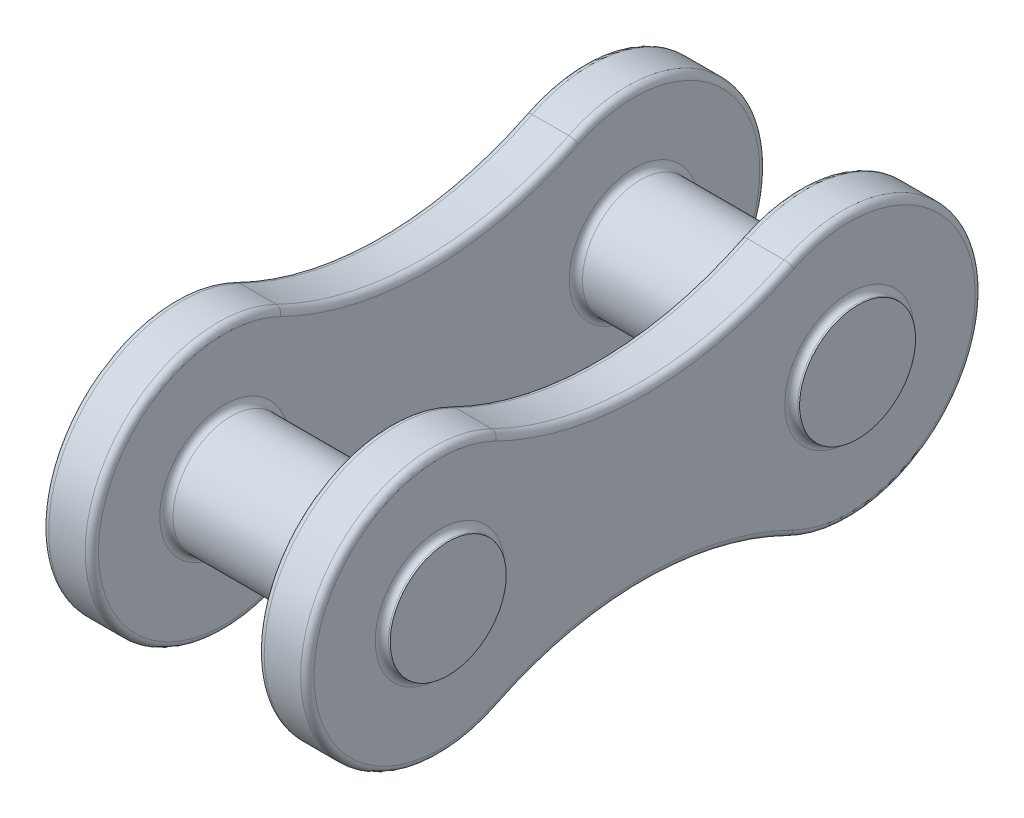
ISO-10303-21;
HEADER;
FILE_DESCRIPTION(('STEP AP214'),'2;1');
FILE_NAME('part.step','',(''),(''),'','','');
FILE_SCHEMA(('AUTOMOTIVE_DESIGN { 1 0 10303 214 1 1 1 1 }'));
ENDSEC;
DATA;
#1=APPLICATION_CONTEXT('core data for automotive mechanical design processes');
#2=APPLICATION_PROTOCOL_DEFINITION('international standard','automotive_design',2000,#1);
#3=PRODUCT_CONTEXT('',#1,'mechanical');
#4=PRODUCT('Part','Part','',(#3));
#5=PRODUCT_RELATED_PRODUCT_CATEGORY('part','',(#4));
#6=PRODUCT_DEFINITION_FORMATION('','',#4);
#7=PRODUCT_DEFINITION_CONTEXT('part definition',#1,'design');
#8=PRODUCT_DEFINITION('design','',#6,#7);
#9=PRODUCT_DEFINITION_SHAPE('','',#8);
#10=(LENGTH_UNIT() NAMED_UNIT(*) SI_UNIT(.MILLI.,.METRE.));
#11=(NAMED_UNIT(*) PLANE_ANGLE_UNIT() SI_UNIT($,.RADIAN.));
#12=(NAMED_UNIT(*) SI_UNIT($,.STERADIAN.) SOLID_ANGLE_UNIT());
#13=UNCERTAINTY_MEASURE_WITH_UNIT(LENGTH_MEASURE(1.E-05),#10,'distance_accuracy_value','');
#14=(GEOMETRIC_REPRESENTATION_CONTEXT(3) GLOBAL_UNCERTAINTY_ASSIGNED_CONTEXT((#13)) GLOBAL_UNIT_ASSIGNED_CONTEXT((#10,
#11,#12)) REPRESENTATION_CONTEXT('',''));
#15=CARTESIAN_POINT('',(0.,0.,0.));
#16=DIRECTION('',(0.,0.,1.));
#17=DIRECTION('',(1.,0.,0.));
#18=AXIS2_PLACEMENT_3D('',#15,#16,#17);
#19=CARTESIAN_POINT('',(4.,6.28230401604379,-3.0875));
#20=DIRECTION('',(1.,0.,0.));
#21=DIRECTION('',(0.,0.,-1.));
#22=AXIS2_PLACEMENT_3D('',#19,#20,#21);
#23=PLANE('',#22);
#24=CARTESIAN_POINT('',(4.,0.,-6.175));
#25=DIRECTION('',(1.,0.,0.));
#26=DIRECTION('',(0.,0.,-1.));
#27=AXIS2_PLACEMENT_3D('',#24,#25,#26);
#28=CIRCLE('',#27,1.95);
#29=CARTESIAN_POINT('',(4.,0.,-8.125));
#30=VERTEX_POINT('',#29);
#31=EDGE_CURVE('E52',#30,#30,#28,.F.);
#32=ORIENTED_EDGE('',*,*,#31,.T.);
#33=EDGE_LOOP('',(#32));
#34=FACE_BOUND('',#33,.T.);
#35=CARTESIAN_POINT('',(4.,-12.5646080320876,0.));
#36=DIRECTION('',(1.,0.,0.));
#37=DIRECTION('',(0.,0.,-1.));
#38=AXIS2_PLACEMENT_3D('',#35,#36,#37);
#39=CIRCLE('',#38,10.2);
#40=CARTESIAN_POINT('',(4.,-3.41039360870949,4.49892857142857));
#41=VERTEX_POINT('',#40);
#42=CARTESIAN_POINT('',(4.,-3.41039360870949,-4.49892857142857));
#43=VERTEX_POINT('',#42);
#44=EDGE_CURVE('E60',#41,#43,#39,.F.);
#45=ORIENTED_EDGE('',*,*,#44,.T.);
#46=CARTESIAN_POINT('',(4.,0.,-6.175));
#47=DIRECTION('',(1.,0.,0.));
#48=DIRECTION('',(0.,0.,-1.));
#49=AXIS2_PLACEMENT_3D('',#46,#47,#48);
#50=CIRCLE('',#49,3.8);
#51=CARTESIAN_POINT('',(4.,3.41039360870949,-4.49892857142857));
#52=VERTEX_POINT('',#51);
#53=EDGE_CURVE('E281',#43,#52,#50,.T.);
#54=ORIENTED_EDGE('',*,*,#53,.T.);
#55=CARTESIAN_POINT('',(4.,12.5646080320876,0.));
#56=DIRECTION('',(1.,0.,0.));
#57=DIRECTION('',(0.,0.,-1.));
#58=AXIS2_PLACEMENT_3D('',#55,#56,#57);
#59=CIRCLE('',#58,10.2);
#60=CARTESIAN_POINT('',(4.,3.41039360870949,4.49892857142857));
#61=VERTEX_POINT('',#60);
#62=EDGE_CURVE('E277',#52,#61,#59,.F.);
#63=ORIENTED_EDGE('',*,*,#62,.T.);
#64=CARTESIAN_POINT('',(4.,0.,6.175));
#65=DIRECTION('',(1.,0.,0.));
#66=DIRECTION('',(0.,0.,-1.));
#67=AXIS2_PLACEMENT_3D('',#64,#65,#66);
#68=CIRCLE('',#67,3.8);
#69=EDGE_CURVE('E65',#61,#41,#68,.T.);
#70=ORIENTED_EDGE('',*,*,#69,.T.);
#71=EDGE_LOOP('',(#45,#54,#63,#70));
#72=FACE_BOUND('',#71,.T.);
#73=CARTESIAN_POINT('',(4.,0.,6.175));
#74=DIRECTION('',(1.,0.,0.));
#75=DIRECTION('',(0.,0.,-1.));
#76=AXIS2_PLACEMENT_3D('',#73,#74,#75);
#77=CIRCLE('',#76,1.95);
#78=CARTESIAN_POINT('',(4.,0.,4.225));
#79=VERTEX_POINT('',#78);
#80=EDGE_CURVE('E274',#79,#79,#77,.F.);
#81=ORIENTED_EDGE('',*,*,#80,.T.);
#82=EDGE_LOOP('',(#81));
#83=FACE_BOUND('',#82,.T.);
#84=ADVANCED_FACE('F43',(#34,#72,#83),#23,.T.);
#85=CARTESIAN_POINT('',(2.5,6.28230401604379,-3.0875));
#86=DIRECTION('',(1.,0.,0.));
#87=DIRECTION('',(0.,0.,-1.));
#88=AXIS2_PLACEMENT_3D('',#85,#86,#87);
#89=PLANE('',#88);
#90=CARTESIAN_POINT('',(2.5,0.,-6.175));
#91=DIRECTION('',(1.,0.,0.));
#92=DIRECTION('',(0.,0.,-1.));
#93=AXIS2_PLACEMENT_3D('',#90,#91,#92);
#94=CIRCLE('',#93,1.95);
#95=CARTESIAN_POINT('',(2.5,0.,-8.125));
#96=VERTEX_POINT('',#95);
#97=EDGE_CURVE('E188',#96,#96,#94,.T.);
#98=ORIENTED_EDGE('',*,*,#97,.T.);
#99=EDGE_LOOP('',(#98));
#100=FACE_BOUND('',#99,.T.);
#101=CARTESIAN_POINT('',(2.5,0.,6.175));
#102=DIRECTION('',(1.,0.,0.));
#103=DIRECTION('',(0.,0.,-1.));
#104=AXIS2_PLACEMENT_3D('',#101,#102,#103);
#105=CIRCLE('',#104,1.95);
#106=CARTESIAN_POINT('',(2.5,0.,4.225));
#107=VERTEX_POINT('',#106);
#108=EDGE_CURVE('E185',#107,#107,#105,.T.);
#109=ORIENTED_EDGE('',*,*,#108,.T.);
#110=EDGE_LOOP('',(#109));
#111=FACE_BOUND('',#110,.T.);
#112=CARTESIAN_POINT('',(2.5,-12.5646080320876,0.));
#113=DIRECTION('',(1.,0.,0.));
#114=DIRECTION('',(0.,0.,-1.));
#115=AXIS2_PLACEMENT_3D('',#112,#113,#114);
#116=CIRCLE('',#115,10.2);
#117=CARTESIAN_POINT('',(2.5,-3.41039360870949,-4.49892857142857));
#118=VERTEX_POINT('',#117);
#119=CARTESIAN_POINT('',(2.5,-3.41039360870949,4.49892857142857));
#120=VERTEX_POINT('',#119);
#121=EDGE_CURVE('E184',#118,#120,#116,.T.);
#122=ORIENTED_EDGE('',*,*,#121,.T.);
#123=CARTESIAN_POINT('',(2.5,0.,6.175));
#124=DIRECTION('',(1.,0.,0.));
#125=DIRECTION('',(0.,0.,-1.));
#126=AXIS2_PLACEMENT_3D('',#123,#124,#125);
#127=CIRCLE('',#126,3.8);
#128=CARTESIAN_POINT('',(2.5,3.41039360870949,4.49892857142857));
#129=VERTEX_POINT('',#128);
#130=EDGE_CURVE('E163',#120,#129,#127,.F.);
#131=ORIENTED_EDGE('',*,*,#130,.T.);
#132=CARTESIAN_POINT('',(2.5,12.5646080320876,0.));
#133=DIRECTION('',(1.,0.,0.));
#134=DIRECTION('',(0.,0.,-1.));
#135=AXIS2_PLACEMENT_3D('',#132,#133,#134);
#136=CIRCLE('',#135,10.2);
#137=CARTESIAN_POINT('',(2.5,3.41039360870949,-4.49892857142857));
#138=VERTEX_POINT('',#137);
#139=EDGE_CURVE('E173',#129,#138,#136,.T.);
#140=ORIENTED_EDGE('',*,*,#139,.T.);
#141=CARTESIAN_POINT('',(2.5,0.,-6.175));
#142=DIRECTION('',(1.,0.,0.));
#143=DIRECTION('',(0.,0.,-1.));
#144=AXIS2_PLACEMENT_3D('',#141,#142,#143);
#145=CIRCLE('',#144,3.8);
#146=EDGE_CURVE('E179',#138,#118,#145,.F.);
#147=ORIENTED_EDGE('',*,*,#146,.T.);
#148=EDGE_LOOP('',(#122,#131,#140,#147));
#149=FACE_BOUND('',#148,.T.);
#150=ADVANCED_FACE('F182',(#100,#111,#149),#89,.F.);
#151=CARTESIAN_POINT('',(4.,12.5646080320876,0.));
#152=DIRECTION('',(-1.,0.,0.));
#153=DIRECTION('',(0.,0.,1.));
#154=AXIS2_PLACEMENT_3D('',#151,#152,#153);
#155=CYLINDRICAL_SURFACE('',#154,10.);
#156=DIRECTION('',(-1.,0.,0.));
#157=VECTOR('',#156,1.);
#158=CARTESIAN_POINT('',(4.,3.58988800916788,-4.41071428571429));
#159=LINE('',#158,#157);
#160=CARTESIAN_POINT('',(3.8,3.58988800916788,-4.41071428571429));
#161=VERTEX_POINT('',#160);
#162=CARTESIAN_POINT('',(2.7,3.58988800916788,-4.41071428571429));
#163=VERTEX_POINT('',#162);
#164=EDGE_CURVE('E359',#161,#163,#159,.T.);
#165=ORIENTED_EDGE('',*,*,#164,.T.);
#166=CARTESIAN_POINT('',(2.7,12.5646080320876,0.));
#167=DIRECTION('',(1.,0.,0.));
#168=DIRECTION('',(0.,0.,-1.));
#169=AXIS2_PLACEMENT_3D('',#166,#167,#168);
#170=CIRCLE('',#169,10.);
#171=CARTESIAN_POINT('',(2.7,3.58988800916788,4.41071428571429));
#172=VERTEX_POINT('',#171);
#173=EDGE_CURVE('E215',#163,#172,#170,.F.);
#174=ORIENTED_EDGE('',*,*,#173,.T.);
#175=DIRECTION('',(-1.,0.,0.));
#176=VECTOR('',#175,1.);
#177=CARTESIAN_POINT('',(4.,3.58988800916788,4.41071428571429));
#178=LINE('',#177,#176);
#179=CARTESIAN_POINT('',(3.8,3.58988800916788,4.41071428571429));
#180=VERTEX_POINT('',#179);
#181=EDGE_CURVE('E331',#180,#172,#178,.T.);
#182=ORIENTED_EDGE('',*,*,#181,.F.);
#183=CARTESIAN_POINT('',(3.8,12.5646080320876,0.));
#184=DIRECTION('',(1.,0.,0.));
#185=DIRECTION('',(0.,0.,-1.));
#186=AXIS2_PLACEMENT_3D('',#183,#184,#185);
#187=CIRCLE('',#186,10.);
#188=EDGE_CURVE('E213',#180,#161,#187,.T.);
#189=ORIENTED_EDGE('',*,*,#188,.T.);
#190=EDGE_LOOP('',(#165,#174,#182,#189));
#191=FACE_BOUND('',#190,.T.);
#192=ADVANCED_FACE('F336',(#191),#155,.F.);
#193=CARTESIAN_POINT('',(4.,0.,6.175));
#194=DIRECTION('',(-1.,0.,0.));
#195=DIRECTION('',(0.,0.,1.));
#196=AXIS2_PLACEMENT_3D('',#193,#194,#195);
#197=CYLINDRICAL_SURFACE('',#196,4.);
#198=ORIENTED_EDGE('',*,*,#181,.T.);
#199=CARTESIAN_POINT('',(2.7,0.,6.175));
#200=DIRECTION('',(1.,0.,0.));
#201=DIRECTION('',(0.,0.,-1.));
#202=AXIS2_PLACEMENT_3D('',#199,#200,#201);
#203=CIRCLE('',#202,4.);
#204=CARTESIAN_POINT('',(2.7,-3.58988800916788,4.41071428571429));
#205=VERTEX_POINT('',#204);
#206=EDGE_CURVE('E166',#172,#205,#203,.T.);
#207=ORIENTED_EDGE('',*,*,#206,.T.);
#208=DIRECTION('',(-1.,0.,0.));
#209=VECTOR('',#208,1.);
#210=CARTESIAN_POINT('',(4.,-3.58988800916788,4.41071428571429));
#211=LINE('',#210,#209);
#212=CARTESIAN_POINT('',(3.8,-3.58988800916788,4.41071428571429));
#213=VERTEX_POINT('',#212);
#214=EDGE_CURVE('E333',#213,#205,#211,.T.);
#215=ORIENTED_EDGE('',*,*,#214,.F.);
#216=CARTESIAN_POINT('',(3.8,0.,6.175));
#217=DIRECTION('',(1.,0.,0.));
#218=DIRECTION('',(0.,0.,-1.));
#219=AXIS2_PLACEMENT_3D('',#216,#217,#218);
#220=CIRCLE('',#219,4.);
#221=EDGE_CURVE('E201',#213,#180,#220,.F.);
#222=ORIENTED_EDGE('',*,*,#221,.T.);
#223=EDGE_LOOP('',(#198,#207,#215,#222));
#224=FACE_BOUND('',#223,.T.);
#225=ADVANCED_FACE('F330',(#224),#197,.T.);
#226=CARTESIAN_POINT('',(4.,-12.5646080320876,0.));
#227=DIRECTION('',(-1.,0.,0.));
#228=DIRECTION('',(0.,0.,1.));
#229=AXIS2_PLACEMENT_3D('',#226,#227,#228);
#230=CYLINDRICAL_SURFACE('',#229,10.);
#231=ORIENTED_EDGE('',*,*,#214,.T.);
#232=CARTESIAN_POINT('',(2.7,-12.5646080320876,0.));
#233=DIRECTION('',(1.,0.,0.));
#234=DIRECTION('',(0.,0.,-1.));
#235=AXIS2_PLACEMENT_3D('',#232,#233,#234);
#236=CIRCLE('',#235,10.);
#237=CARTESIAN_POINT('',(2.7,-3.58988800916788,-4.41071428571429));
#238=VERTEX_POINT('',#237);
#239=EDGE_CURVE('E206',#205,#238,#236,.F.);
#240=ORIENTED_EDGE('',*,*,#239,.T.);
#241=DIRECTION('',(-1.,0.,0.));
#242=VECTOR('',#241,1.);
#243=CARTESIAN_POINT('',(4.,-3.58988800916788,-4.41071428571429));
#244=LINE('',#243,#242);
#245=CARTESIAN_POINT('',(3.8,-3.58988800916788,-4.41071428571429));
#246=VERTEX_POINT('',#245);
#247=EDGE_CURVE('E342',#246,#238,#244,.T.);
#248=ORIENTED_EDGE('',*,*,#247,.F.);
#249=CARTESIAN_POINT('',(3.8,-12.5646080320876,0.));
#250=DIRECTION('',(1.,0.,0.));
#251=DIRECTION('',(0.,0.,-1.));
#252=AXIS2_PLACEMENT_3D('',#249,#250,#251);
#253=CIRCLE('',#252,10.);
#254=EDGE_CURVE('E204',#246,#213,#253,.T.);
#255=ORIENTED_EDGE('',*,*,#254,.T.);
#256=EDGE_LOOP('',(#231,#240,#248,#255));
#257=FACE_BOUND('',#256,.T.);
#258=ADVANCED_FACE('F357',(#257),#230,.F.);
#259=CARTESIAN_POINT('',(4.,0.,-6.175));
#260=DIRECTION('',(-1.,0.,0.));
#261=DIRECTION('',(0.,0.,1.));
#262=AXIS2_PLACEMENT_3D('',#259,#260,#261);
#263=CYLINDRICAL_SURFACE('',#262,4.);
#264=ORIENTED_EDGE('',*,*,#247,.T.);
#265=CARTESIAN_POINT('',(2.7,0.,-6.175));
#266=DIRECTION('',(1.,0.,0.));
#267=DIRECTION('',(0.,0.,-1.));
#268=AXIS2_PLACEMENT_3D('',#265,#266,#267);
#269=CIRCLE('',#268,4.);
#270=EDGE_CURVE('E211',#238,#163,#269,.T.);
#271=ORIENTED_EDGE('',*,*,#270,.T.);
#272=ORIENTED_EDGE('',*,*,#164,.F.);
#273=CARTESIAN_POINT('',(3.8,0.,-6.175));
#274=DIRECTION('',(1.,0.,0.));
#275=DIRECTION('',(0.,0.,-1.));
#276=AXIS2_PLACEMENT_3D('',#273,#274,#275);
#277=CIRCLE('',#276,4.);
#278=EDGE_CURVE('E208',#161,#246,#277,.F.);
#279=ORIENTED_EDGE('',*,*,#278,.T.);
#280=EDGE_LOOP('',(#264,#271,#272,#279));
#281=FACE_BOUND('',#280,.T.);
#282=ADVANCED_FACE('F420',(#281),#263,.T.);
#283=CARTESIAN_POINT('',(4.25,0.,-6.175));
#284=DIRECTION('',(-1.,0.,0.));
#285=DIRECTION('',(0.,0.,1.));
#286=AXIS2_PLACEMENT_3D('',#283,#284,#285);
#287=CYLINDRICAL_SURFACE('',#286,1.75);
#288=CARTESIAN_POINT('',(2.3,0.,-6.175));
#289=DIRECTION('',(1.,0.,0.));
#290=DIRECTION('',(0.,0.,-1.));
#291=AXIS2_PLACEMENT_3D('',#288,#289,#290);
#292=CIRCLE('',#291,1.75);
#293=CARTESIAN_POINT('',(2.3,0.,-7.925));
#294=VERTEX_POINT('',#293);
#295=EDGE_CURVE('E180',#294,#294,#292,.F.);
#296=ORIENTED_EDGE('',*,*,#295,.T.);
#297=EDGE_LOOP('',(#296));
#298=FACE_BOUND('',#297,.T.);
#299=CARTESIAN_POINT('',(-2.3,0.,-6.175));
#300=DIRECTION('',(1.,0.,0.));
#301=DIRECTION('',(0.,0.,-1.));
#302=AXIS2_PLACEMENT_3D('',#299,#300,#301);
#303=CIRCLE('',#302,1.75);
#304=CARTESIAN_POINT('',(-2.3,0.,-7.925));
#305=VERTEX_POINT('',#304);
#306=EDGE_CURVE('E338',#305,#305,#303,.T.);
#307=ORIENTED_EDGE('',*,*,#306,.T.);
#308=EDGE_LOOP('',(#307));
#309=FACE_BOUND('',#308,.T.);
#310=ADVANCED_FACE('F423',(#298,#309),#287,.T.);
#311=CARTESIAN_POINT('',(4.2,0.,-6.175));
#312=DIRECTION('',(1.,0.,0.));
#313=DIRECTION('',(0.,0.,-1.));
#314=AXIS2_PLACEMENT_3D('',#311,#312,#313);
#315=CIRCLE('',#314,1.75);
#316=CARTESIAN_POINT('',(4.2,0.,-7.925));
#317=VERTEX_POINT('',#316);
#318=EDGE_CURVE('E271',#317,#317,#315,.T.);
#319=ORIENTED_EDGE('',*,*,#318,.T.);
#320=EDGE_LOOP('',(#319));
#321=FACE_BOUND('',#320,.T.);
#322=CARTESIAN_POINT('',(4.25,0.,-6.175));
#323=DIRECTION('',(1.,0.,0.));
#324=DIRECTION('',(0.,0.,-1.));
#325=AXIS2_PLACEMENT_3D('',#322,#323,#324);
#326=CIRCLE('',#325,1.75);
#327=CARTESIAN_POINT('',(4.25,0.,-7.925));
#328=VERTEX_POINT('',#327);
#329=EDGE_CURVE('E360',#328,#328,#326,.T.);
#330=ORIENTED_EDGE('',*,*,#329,.F.);
#331=EDGE_LOOP('',(#330));
#332=FACE_BOUND('',#331,.T.);
#333=ADVANCED_FACE('F417',(#321,#332),#287,.T.);
#334=CARTESIAN_POINT('',(4.25,0.,-6.175));
#335=DIRECTION('',(1.,0.,0.));
#336=DIRECTION('',(0.,0.,-1.));
#337=AXIS2_PLACEMENT_3D('',#334,#335,#336);
#338=PLANE('',#337);
#339=ORIENTED_EDGE('',*,*,#329,.T.);
#340=EDGE_LOOP('',(#339));
#341=FACE_BOUND('',#340,.T.);
#342=ADVANCED_FACE('F736',(#341),#338,.T.);
#343=CARTESIAN_POINT('',(-4.,0.,6.175));
#344=DIRECTION('',(1.,0.,0.));
#345=DIRECTION('',(0.,0.,-1.));
#346=AXIS2_PLACEMENT_3D('',#343,#344,#345);
#347=CYLINDRICAL_SURFACE('',#346,4.);
#348=DIRECTION('',(1.,0.,0.));
#349=VECTOR('',#348,1.);
#350=CARTESIAN_POINT('',(-4.,3.58988800916788,4.41071428571428));
#351=LINE('',#350,#349);
#352=CARTESIAN_POINT('',(-3.8,3.58988800916788,4.41071428571428));
#353=VERTEX_POINT('',#352);
#354=CARTESIAN_POINT('',(-2.7,3.58988800916788,4.41071428571428));
#355=VERTEX_POINT('',#354);
#356=EDGE_CURVE('E366',#353,#355,#351,.T.);
#357=ORIENTED_EDGE('',*,*,#356,.F.);
#358=CARTESIAN_POINT('',(-3.8,0.,6.175));
#359=DIRECTION('',(1.,0.,0.));
#360=DIRECTION('',(0.,0.,-1.));
#361=AXIS2_PLACEMENT_3D('',#358,#359,#360);
#362=CIRCLE('',#361,4.);
#363=CARTESIAN_POINT('',(-3.8,-3.58988800916788,4.41071428571429));
#364=VERTEX_POINT('',#363);
#365=EDGE_CURVE('E248',#353,#364,#362,.T.);
#366=ORIENTED_EDGE('',*,*,#365,.T.);
#367=DIRECTION('',(1.,0.,0.));
#368=VECTOR('',#367,1.);
#369=CARTESIAN_POINT('',(-4.,-3.58988800916788,4.41071428571429));
#370=LINE('',#369,#368);
#371=CARTESIAN_POINT('',(-2.7,-3.58988800916788,4.41071428571429));
#372=VERTEX_POINT('',#371);
#373=EDGE_CURVE('E369',#364,#372,#370,.T.);
#374=ORIENTED_EDGE('',*,*,#373,.T.);
#375=CARTESIAN_POINT('',(-2.7,0.,6.175));
#376=DIRECTION('',(1.,0.,0.));
#377=DIRECTION('',(0.,0.,-1.));
#378=AXIS2_PLACEMENT_3D('',#375,#376,#377);
#379=CIRCLE('',#378,4.);
#380=EDGE_CURVE('E246',#372,#355,#379,.F.);
#381=ORIENTED_EDGE('',*,*,#380,.T.);
#382=EDGE_LOOP('',(#357,#366,#374,#381));
#383=FACE_BOUND('',#382,.T.);
#384=ADVANCED_FACE('F740',(#383),#347,.T.);
#385=CARTESIAN_POINT('',(-4.,12.5646080320876,0.));
#386=DIRECTION('',(1.,0.,0.));
#387=DIRECTION('',(0.,0.,-1.));
#388=AXIS2_PLACEMENT_3D('',#385,#386,#387);
#389=CYLINDRICAL_SURFACE('',#388,10.);
#390=DIRECTION('',(1.,0.,0.));
#391=VECTOR('',#390,1.);
#392=CARTESIAN_POINT('',(-4.,3.58988800916788,-4.41071428571429));
#393=LINE('',#392,#391);
#394=CARTESIAN_POINT('',(-3.8,3.58988800916788,-4.41071428571429));
#395=VERTEX_POINT('',#394);
#396=CARTESIAN_POINT('',(-2.7,3.58988800916788,-4.41071428571429));
#397=VERTEX_POINT('',#396);
#398=EDGE_CURVE('E376',#395,#397,#393,.T.);
#399=ORIENTED_EDGE('',*,*,#398,.F.);
#400=CARTESIAN_POINT('',(-3.8,12.5646080320876,0.));
#401=DIRECTION('',(1.,0.,0.));
#402=DIRECTION('',(0.,0.,-1.));
#403=AXIS2_PLACEMENT_3D('',#400,#401,#402);
#404=CIRCLE('',#403,10.);
#405=EDGE_CURVE('E244',#395,#353,#404,.F.);
#406=ORIENTED_EDGE('',*,*,#405,.T.);
#407=ORIENTED_EDGE('',*,*,#356,.T.);
#408=CARTESIAN_POINT('',(-2.7,12.5646080320876,0.));
#409=DIRECTION('',(1.,0.,0.));
#410=DIRECTION('',(0.,0.,-1.));
#411=AXIS2_PLACEMENT_3D('',#408,#409,#410);
#412=CIRCLE('',#411,10.);
#413=EDGE_CURVE('E241',#355,#397,#412,.T.);
#414=ORIENTED_EDGE('',*,*,#413,.T.);
#415=EDGE_LOOP('',(#399,#406,#407,#414));
#416=FACE_BOUND('',#415,.T.);
#417=ADVANCED_FACE('F783',(#416),#389,.F.);
#418=CARTESIAN_POINT('',(-4.,0.,-6.175));
#419=DIRECTION('',(1.,0.,0.));
#420=DIRECTION('',(0.,0.,-1.));
#421=AXIS2_PLACEMENT_3D('',#418,#419,#420);
#422=CYLINDRICAL_SURFACE('',#421,4.);
#423=DIRECTION('',(1.,0.,0.));
#424=VECTOR('',#423,1.);
#425=CARTESIAN_POINT('',(-4.,-3.58988800916788,-4.41071428571429));
#426=LINE('',#425,#424);
#427=CARTESIAN_POINT('',(-3.8,-3.58988800916788,-4.41071428571429));
#428=VERTEX_POINT('',#427);
#429=CARTESIAN_POINT('',(-2.7,-3.58988800916788,-4.41071428571429));
#430=VERTEX_POINT('',#429);
#431=EDGE_CURVE('E372',#428,#430,#426,.T.);
#432=ORIENTED_EDGE('',*,*,#431,.F.);
#433=CARTESIAN_POINT('',(-3.8,0.,-6.175));
#434=DIRECTION('',(1.,0.,0.));
#435=DIRECTION('',(0.,0.,-1.));
#436=AXIS2_PLACEMENT_3D('',#433,#434,#435);
#437=CIRCLE('',#436,4.);
#438=EDGE_CURVE('E239',#428,#395,#437,.T.);
#439=ORIENTED_EDGE('',*,*,#438,.T.);
#440=ORIENTED_EDGE('',*,*,#398,.T.);
#441=CARTESIAN_POINT('',(-2.7,0.,-6.175));
#442=DIRECTION('',(1.,0.,0.));
#443=DIRECTION('',(0.,0.,-1.));
#444=AXIS2_PLACEMENT_3D('',#441,#442,#443);
#445=CIRCLE('',#444,4.);
#446=EDGE_CURVE('E237',#397,#430,#445,.F.);
#447=ORIENTED_EDGE('',*,*,#446,.T.);
#448=EDGE_LOOP('',(#432,#439,#440,#447));
#449=FACE_BOUND('',#448,.T.);
#450=ADVANCED_FACE('F775',(#449),#422,.T.);
#451=CARTESIAN_POINT('',(-4.,-12.5646080320876,0.));
#452=DIRECTION('',(1.,0.,0.));
#453=DIRECTION('',(0.,0.,-1.));
#454=AXIS2_PLACEMENT_3D('',#451,#452,#453);
#455=CYLINDRICAL_SURFACE('',#454,10.);
#456=ORIENTED_EDGE('',*,*,#373,.F.);
#457=CARTESIAN_POINT('',(-3.8,-12.5646080320876,0.));
#458=DIRECTION('',(1.,0.,0.));
#459=DIRECTION('',(0.,0.,-1.));
#460=AXIS2_PLACEMENT_3D('',#457,#458,#459);
#461=CIRCLE('',#460,10.);
#462=EDGE_CURVE('E219',#364,#428,#461,.F.);
#463=ORIENTED_EDGE('',*,*,#462,.T.);
#464=ORIENTED_EDGE('',*,*,#431,.T.);
#465=CARTESIAN_POINT('',(-2.7,-12.5646080320876,0.));
#466=DIRECTION('',(1.,0.,0.));
#467=DIRECTION('',(0.,0.,-1.));
#468=AXIS2_PLACEMENT_3D('',#465,#466,#467);
#469=CIRCLE('',#468,10.);
#470=EDGE_CURVE('E217',#430,#372,#469,.T.);
#471=ORIENTED_EDGE('',*,*,#470,.T.);
#472=EDGE_LOOP('',(#456,#463,#464,#471));
#473=FACE_BOUND('',#472,.T.);
#474=ADVANCED_FACE('F768',(#473),#455,.F.);
#475=CARTESIAN_POINT('',(-4.,-6.28230401604379,3.0875));
#476=DIRECTION('',(1.,0.,0.));
#477=DIRECTION('',(0.,0.,-1.));
#478=AXIS2_PLACEMENT_3D('',#475,#476,#477);
#479=PLANE('',#478);
#480=CARTESIAN_POINT('',(-4.,0.,-6.175));
#481=DIRECTION('',(1.,0.,0.));
#482=DIRECTION('',(0.,0.,-1.));
#483=AXIS2_PLACEMENT_3D('',#480,#481,#482);
#484=CIRCLE('',#483,3.8);
#485=CARTESIAN_POINT('',(-4.,3.41039360870949,-4.49892857142857));
#486=VERTEX_POINT('',#485);
#487=CARTESIAN_POINT('',(-4.,-3.41039360870949,-4.49892857142857));
#488=VERTEX_POINT('',#487);
#489=EDGE_CURVE('E232',#486,#488,#484,.F.);
#490=ORIENTED_EDGE('',*,*,#489,.T.);
#491=CARTESIAN_POINT('',(-4.,-12.5646080320876,0.));
#492=DIRECTION('',(1.,0.,0.));
#493=DIRECTION('',(0.,0.,-1.));
#494=AXIS2_PLACEMENT_3D('',#491,#492,#493);
#495=CIRCLE('',#494,10.2);
#496=CARTESIAN_POINT('',(-4.,-3.41039360870949,4.49892857142857));
#497=VERTEX_POINT('',#496);
#498=EDGE_CURVE('E234',#488,#497,#495,.T.);
#499=ORIENTED_EDGE('',*,*,#498,.T.);
#500=CARTESIAN_POINT('',(-4.,0.,6.175));
#501=DIRECTION('',(1.,0.,0.));
#502=DIRECTION('',(0.,0.,-1.));
#503=AXIS2_PLACEMENT_3D('',#500,#501,#502);
#504=CIRCLE('',#503,3.8);
#505=CARTESIAN_POINT('',(-4.,3.41039360870948,4.49892857142857));
#506=VERTEX_POINT('',#505);
#507=EDGE_CURVE('E228',#497,#506,#504,.F.);
#508=ORIENTED_EDGE('',*,*,#507,.T.);
#509=CARTESIAN_POINT('',(-4.,12.5646080320876,0.));
#510=DIRECTION('',(1.,0.,0.));
#511=DIRECTION('',(0.,0.,-1.));
#512=AXIS2_PLACEMENT_3D('',#509,#510,#511);
#513=CIRCLE('',#512,10.2);
#514=EDGE_CURVE('E230',#506,#486,#513,.T.);
#515=ORIENTED_EDGE('',*,*,#514,.T.);
#516=EDGE_LOOP('',(#490,#499,#508,#515));
#517=FACE_BOUND('',#516,.T.);
#518=CARTESIAN_POINT('',(-4.,0.,-6.175));
#519=DIRECTION('',(1.,0.,0.));
#520=DIRECTION('',(0.,0.,-1.));
#521=AXIS2_PLACEMENT_3D('',#518,#519,#520);
#522=CIRCLE('',#521,1.95);
#523=CARTESIAN_POINT('',(-4.,0.,-8.125));
#524=VERTEX_POINT('',#523);
#525=EDGE_CURVE('E225',#524,#524,#522,.T.);
#526=ORIENTED_EDGE('',*,*,#525,.T.);
#527=EDGE_LOOP('',(#526));
#528=FACE_BOUND('',#527,.T.);
#529=CARTESIAN_POINT('',(-4.,0.,6.175));
#530=DIRECTION('',(1.,0.,0.));
#531=DIRECTION('',(0.,0.,-1.));
#532=AXIS2_PLACEMENT_3D('',#529,#530,#531);
#533=CIRCLE('',#532,1.95);
#534=CARTESIAN_POINT('',(-4.,0.,4.225));
#535=VERTEX_POINT('',#534);
#536=EDGE_CURVE('E222',#535,#535,#533,.T.);
#537=ORIENTED_EDGE('',*,*,#536,.T.);
#538=EDGE_LOOP('',(#537));
#539=FACE_BOUND('',#538,.T.);
#540=ADVANCED_FACE('F760',(#517,#528,#539),#479,.F.);
#541=CARTESIAN_POINT('',(-2.5,-6.28230401604379,3.0875));
#542=DIRECTION('',(1.,0.,0.));
#543=DIRECTION('',(0.,0.,-1.));
#544=AXIS2_PLACEMENT_3D('',#541,#542,#543);
#545=PLANE('',#544);
#546=CARTESIAN_POINT('',(-2.5,0.,-6.175));
#547=DIRECTION('',(1.,0.,0.));
#548=DIRECTION('',(0.,0.,-1.));
#549=AXIS2_PLACEMENT_3D('',#546,#547,#548);
#550=CIRCLE('',#549,3.8);
#551=CARTESIAN_POINT('',(-2.5,-3.41039360870949,-4.49892857142857));
#552=VERTEX_POINT('',#551);
#553=CARTESIAN_POINT('',(-2.5,3.41039360870949,-4.49892857142857));
#554=VERTEX_POINT('',#553);
#555=EDGE_CURVE('E266',#552,#554,#550,.T.);
#556=ORIENTED_EDGE('',*,*,#555,.T.);
#557=CARTESIAN_POINT('',(-2.5,12.5646080320876,0.));
#558=DIRECTION('',(1.,0.,0.));
#559=DIRECTION('',(0.,0.,-1.));
#560=AXIS2_PLACEMENT_3D('',#557,#558,#559);
#561=CIRCLE('',#560,10.2);
#562=CARTESIAN_POINT('',(-2.5,3.41039360870948,4.49892857142857));
#563=VERTEX_POINT('',#562);
#564=EDGE_CURVE('E268',#554,#563,#561,.F.);
#565=ORIENTED_EDGE('',*,*,#564,.T.);
#566=CARTESIAN_POINT('',(-2.5,0.,6.175));
#567=DIRECTION('',(1.,0.,0.));
#568=DIRECTION('',(0.,0.,-1.));
#569=AXIS2_PLACEMENT_3D('',#566,#567,#568);
#570=CIRCLE('',#569,3.8);
#571=CARTESIAN_POINT('',(-2.5,-3.41039360870949,4.49892857142857));
#572=VERTEX_POINT('',#571);
#573=EDGE_CURVE('E262',#563,#572,#570,.T.);
#574=ORIENTED_EDGE('',*,*,#573,.T.);
#575=CARTESIAN_POINT('',(-2.5,-12.5646080320876,0.));
#576=DIRECTION('',(1.,0.,0.));
#577=DIRECTION('',(0.,0.,-1.));
#578=AXIS2_PLACEMENT_3D('',#575,#576,#577);
#579=CIRCLE('',#578,10.2);
#580=EDGE_CURVE('E264',#572,#552,#579,.F.);
#581=ORIENTED_EDGE('',*,*,#580,.T.);
#582=EDGE_LOOP('',(#556,#565,#574,#581));
#583=FACE_BOUND('',#582,.T.);
#584=CARTESIAN_POINT('',(-2.5,0.,-6.175));
#585=DIRECTION('',(1.,0.,0.));
#586=DIRECTION('',(0.,0.,-1.));
#587=AXIS2_PLACEMENT_3D('',#584,#585,#586);
#588=CIRCLE('',#587,1.95);
#589=CARTESIAN_POINT('',(-2.5,0.,-8.125));
#590=VERTEX_POINT('',#589);
#591=EDGE_CURVE('E259',#590,#590,#588,.F.);
#592=ORIENTED_EDGE('',*,*,#591,.T.);
#593=EDGE_LOOP('',(#592));
#594=FACE_BOUND('',#593,.T.);
#595=CARTESIAN_POINT('',(-2.5,0.,6.175));
#596=DIRECTION('',(1.,0.,0.));
#597=DIRECTION('',(0.,0.,-1.));
#598=AXIS2_PLACEMENT_3D('',#595,#596,#597);
#599=CIRCLE('',#598,1.95);
#600=CARTESIAN_POINT('',(-2.5,0.,4.225));
#601=VERTEX_POINT('',#600);
#602=EDGE_CURVE('E256',#601,#601,#599,.F.);
#603=ORIENTED_EDGE('',*,*,#602,.T.);
#604=EDGE_LOOP('',(#603));
#605=FACE_BOUND('',#604,.T.);
#606=ADVANCED_FACE('F732',(#583,#594,#605),#545,.T.);
#607=CARTESIAN_POINT('',(-4.25,0.,-6.175));
#608=DIRECTION('',(1.,0.,0.));
#609=DIRECTION('',(0.,0.,-1.));
#610=AXIS2_PLACEMENT_3D('',#607,#608,#609);
#611=PLANE('',#610);
#612=CARTESIAN_POINT('',(-4.25,0.,-6.175));
#613=DIRECTION('',(1.,0.,0.));
#614=DIRECTION('',(0.,0.,-1.));
#615=AXIS2_PLACEMENT_3D('',#612,#613,#614);
#616=CIRCLE('',#615,1.75);
#617=CARTESIAN_POINT('',(-4.25,0.,-7.925));
#618=VERTEX_POINT('',#617);
#619=EDGE_CURVE('E363',#618,#618,#616,.T.);
#620=ORIENTED_EDGE('',*,*,#619,.F.);
#621=EDGE_LOOP('',(#620));
#622=FACE_BOUND('',#621,.T.);
#623=ADVANCED_FACE('F725',(#622),#611,.F.);
#624=CARTESIAN_POINT('',(-4.2,0.,-6.175));
#625=DIRECTION('',(1.,0.,0.));
#626=DIRECTION('',(0.,0.,-1.));
#627=AXIS2_PLACEMENT_3D('',#624,#625,#626);
#628=CIRCLE('',#627,1.75);
#629=CARTESIAN_POINT('',(-4.2,0.,-7.925));
#630=VERTEX_POINT('',#629);
#631=EDGE_CURVE('E250',#630,#630,#628,.F.);
#632=ORIENTED_EDGE('',*,*,#631,.T.);
#633=EDGE_LOOP('',(#632));
#634=FACE_BOUND('',#633,.T.);
#635=ORIENTED_EDGE('',*,*,#619,.T.);
#636=EDGE_LOOP('',(#635));
#637=FACE_BOUND('',#636,.T.);
#638=ADVANCED_FACE('F406',(#634,#637),#287,.T.);
#639=CARTESIAN_POINT('',(4.25,0.,6.175));
#640=DIRECTION('',(-1.,0.,0.));
#641=DIRECTION('',(0.,0.,1.));
#642=AXIS2_PLACEMENT_3D('',#639,#640,#641);
#643=CYLINDRICAL_SURFACE('',#642,1.75);
#644=CARTESIAN_POINT('',(2.3,0.,6.175));
#645=DIRECTION('',(1.,0.,0.));
#646=DIRECTION('',(0.,0.,-1.));
#647=AXIS2_PLACEMENT_3D('',#644,#645,#646);
#648=CIRCLE('',#647,1.75);
#649=CARTESIAN_POINT('',(2.3,0.,4.425));
#650=VERTEX_POINT('',#649);
#651=EDGE_CURVE('E198',#650,#650,#648,.F.);
#652=ORIENTED_EDGE('',*,*,#651,.T.);
#653=EDGE_LOOP('',(#652));
#654=FACE_BOUND('',#653,.T.);
#655=CARTESIAN_POINT('',(-2.3,0.,6.175));
#656=DIRECTION('',(1.,0.,0.));
#657=DIRECTION('',(0.,0.,-1.));
#658=AXIS2_PLACEMENT_3D('',#655,#656,#657);
#659=CIRCLE('',#658,1.75);
#660=CARTESIAN_POINT('',(-2.3,0.,4.425));
#661=VERTEX_POINT('',#660);
#662=EDGE_CURVE('E195',#661,#661,#659,.T.);
#663=ORIENTED_EDGE('',*,*,#662,.T.);
#664=EDGE_LOOP('',(#663));
#665=FACE_BOUND('',#664,.T.);
#666=ADVANCED_FACE('F393',(#654,#665),#643,.T.);
#667=CARTESIAN_POINT('',(-4.25,0.,6.175));
#668=DIRECTION('',(1.,0.,0.));
#669=DIRECTION('',(0.,0.,-1.));
#670=AXIS2_PLACEMENT_3D('',#667,#668,#669);
#671=PLANE('',#670);
#672=CARTESIAN_POINT('',(-4.25,0.,6.175));
#673=DIRECTION('',(1.,0.,0.));
#674=DIRECTION('',(0.,0.,-1.));
#675=AXIS2_PLACEMENT_3D('',#672,#673,#674);
#676=CIRCLE('',#675,1.75);
#677=CARTESIAN_POINT('',(-4.25,0.,4.425));
#678=VERTEX_POINT('',#677);
#679=EDGE_CURVE('E290',#678,#678,#676,.T.);
#680=ORIENTED_EDGE('',*,*,#679,.F.);
#681=EDGE_LOOP('',(#680));
#682=FACE_BOUND('',#681,.T.);
#683=ADVANCED_FACE('F401',(#682),#671,.F.);
#684=CARTESIAN_POINT('',(-4.2,0.,6.175));
#685=DIRECTION('',(1.,0.,0.));
#686=DIRECTION('',(0.,0.,-1.));
#687=AXIS2_PLACEMENT_3D('',#684,#685,#686);
#688=CIRCLE('',#687,1.75);
#689=CARTESIAN_POINT('',(-4.2,0.,4.425));
#690=VERTEX_POINT('',#689);
#691=EDGE_CURVE('E253',#690,#690,#688,.F.);
#692=ORIENTED_EDGE('',*,*,#691,.T.);
#693=EDGE_LOOP('',(#692));
#694=FACE_BOUND('',#693,.T.);
#695=ORIENTED_EDGE('',*,*,#679,.T.);
#696=EDGE_LOOP('',(#695));
#697=FACE_BOUND('',#696,.T.);
#698=ADVANCED_FACE('F390',(#694,#697),#643,.T.);
#699=CARTESIAN_POINT('',(4.2,0.,6.175));
#700=DIRECTION('',(1.,0.,0.));
#701=DIRECTION('',(0.,0.,-1.));
#702=AXIS2_PLACEMENT_3D('',#699,#700,#701);
#703=CIRCLE('',#702,1.75);
#704=CARTESIAN_POINT('',(4.2,0.,4.425));
#705=VERTEX_POINT('',#704);
#706=EDGE_CURVE('E11',#705,#705,#703,.T.);
#707=ORIENTED_EDGE('',*,*,#706,.T.);
#708=EDGE_LOOP('',(#707));
#709=FACE_BOUND('',#708,.T.);
#710=CARTESIAN_POINT('',(4.25,0.,6.175));
#711=DIRECTION('',(1.,0.,0.));
#712=DIRECTION('',(0.,0.,-1.));
#713=AXIS2_PLACEMENT_3D('',#710,#711,#712);
#714=CIRCLE('',#713,1.75);
#715=CARTESIAN_POINT('',(4.25,0.,4.425));
#716=VERTEX_POINT('',#715);
#717=EDGE_CURVE('E373',#716,#716,#714,.T.);
#718=ORIENTED_EDGE('',*,*,#717,.F.);
#719=EDGE_LOOP('',(#718));
#720=FACE_BOUND('',#719,.T.);
#721=ADVANCED_FACE('F388',(#709,#720),#643,.T.);
#722=CARTESIAN_POINT('',(4.25,0.,6.175));
#723=DIRECTION('',(1.,0.,0.));
#724=DIRECTION('',(0.,0.,-1.));
#725=AXIS2_PLACEMENT_3D('',#722,#723,#724);
#726=PLANE('',#725);
#727=ORIENTED_EDGE('',*,*,#717,.T.);
#728=EDGE_LOOP('',(#727));
#729=FACE_BOUND('',#728,.T.);
#730=ADVANCED_FACE('F386',(#729),#726,.T.);
#731=CARTESIAN_POINT('',(2.3,0.,-6.175));
#732=DIRECTION('',(1.,0.,0.));
#733=DIRECTION('',(0.,0.,-1.));
#734=AXIS2_PLACEMENT_3D('',#731,#732,#733);
#735=TOROIDAL_SURFACE('',#734,1.95,0.2);
#736=ORIENTED_EDGE('',*,*,#97,.F.);
#737=EDGE_LOOP('',(#736));
#738=FACE_BOUND('',#737,.T.);
#739=ORIENTED_EDGE('',*,*,#295,.F.);
#740=EDGE_LOOP('',(#739));
#741=FACE_BOUND('',#740,.T.);
#742=ADVANCED_FACE('F399',(#738,#741),#735,.F.);
#743=CARTESIAN_POINT('',(2.3,0.,6.175));
#744=DIRECTION('',(1.,0.,0.));
#745=DIRECTION('',(0.,0.,-1.));
#746=AXIS2_PLACEMENT_3D('',#743,#744,#745);
#747=TOROIDAL_SURFACE('',#746,1.95,0.2);
#748=ORIENTED_EDGE('',*,*,#108,.F.);
#749=EDGE_LOOP('',(#748));
#750=FACE_BOUND('',#749,.T.);
#751=ORIENTED_EDGE('',*,*,#651,.F.);
#752=EDGE_LOOP('',(#751));
#753=FACE_BOUND('',#752,.T.);
#754=ADVANCED_FACE('F432',(#750,#753),#747,.F.);
#755=CARTESIAN_POINT('',(2.7,0.,-6.175));
#756=DIRECTION('',(1.,0.,0.));
#757=DIRECTION('',(0.,0.,-1.));
#758=AXIS2_PLACEMENT_3D('',#755,#756,#757);
#759=TOROIDAL_SURFACE('',#758,3.8,0.2);
#760=CARTESIAN_POINT('',(2.7,-3.41039360870949,-4.49892857142857));
#761=DIRECTION('',(0.,0.44107142857143,0.89747200229197));
#762=DIRECTION('',(0.,-0.89747200229197,0.44107142857143));
#763=AXIS2_PLACEMENT_3D('',#760,#761,#762);
#764=CIRCLE('',#763,0.2);
#765=EDGE_CURVE('E169',#118,#238,#764,.T.);
#766=ORIENTED_EDGE('',*,*,#765,.F.);
#767=ORIENTED_EDGE('',*,*,#146,.F.);
#768=CARTESIAN_POINT('',(2.7,3.41039360870949,-4.49892857142857));
#769=DIRECTION('',(0.,-0.44107142857143,0.89747200229197));
#770=DIRECTION('',(0.,-0.89747200229197,-0.44107142857143));
#771=AXIS2_PLACEMENT_3D('',#768,#769,#770);
#772=CIRCLE('',#771,0.2);
#773=EDGE_CURVE('E176',#163,#138,#772,.T.);
#774=ORIENTED_EDGE('',*,*,#773,.F.);
#775=ORIENTED_EDGE('',*,*,#270,.F.);
#776=EDGE_LOOP('',(#766,#767,#774,#775));
#777=FACE_BOUND('',#776,.T.);
#778=ADVANCED_FACE('F350',(#777),#759,.T.);
#779=CARTESIAN_POINT('',(2.7,12.5646080320876,0.));
#780=DIRECTION('',(1.,0.,0.));
#781=DIRECTION('',(0.,0.,-1.));
#782=AXIS2_PLACEMENT_3D('',#779,#780,#781);
#783=TOROIDAL_SURFACE('',#782,10.2,0.2);
#784=ORIENTED_EDGE('',*,*,#773,.T.);
#785=ORIENTED_EDGE('',*,*,#139,.F.);
#786=CARTESIAN_POINT('',(2.7,3.41039360870949,4.49892857142857));
#787=DIRECTION('',(0.,0.44107142857143,0.89747200229197));
#788=DIRECTION('',(0.,-0.89747200229197,0.44107142857143));
#789=AXIS2_PLACEMENT_3D('',#786,#787,#788);
#790=CIRCLE('',#789,0.2);
#791=EDGE_CURVE('E159',#172,#129,#790,.T.);
#792=ORIENTED_EDGE('',*,*,#791,.F.);
#793=ORIENTED_EDGE('',*,*,#173,.F.);
#794=EDGE_LOOP('',(#784,#785,#792,#793));
#795=FACE_BOUND('',#794,.T.);
#796=ADVANCED_FACE('F174',(#795),#783,.T.);
#797=CARTESIAN_POINT('',(2.7,-12.5646080320876,0.));
#798=DIRECTION('',(1.,0.,0.));
#799=DIRECTION('',(0.,0.,-1.));
#800=AXIS2_PLACEMENT_3D('',#797,#798,#799);
#801=TOROIDAL_SURFACE('',#800,10.2,0.2);
#802=ORIENTED_EDGE('',*,*,#765,.T.);
#803=ORIENTED_EDGE('',*,*,#239,.F.);
#804=CARTESIAN_POINT('',(2.7,-3.41039360870949,4.49892857142857));
#805=DIRECTION('',(0.,-0.44107142857143,0.89747200229197));
#806=DIRECTION('',(0.,-0.89747200229197,-0.44107142857143));
#807=AXIS2_PLACEMENT_3D('',#804,#805,#806);
#808=CIRCLE('',#807,0.2);
#809=EDGE_CURVE('E170',#120,#205,#808,.T.);
#810=ORIENTED_EDGE('',*,*,#809,.F.);
#811=ORIENTED_EDGE('',*,*,#121,.F.);
#812=EDGE_LOOP('',(#802,#803,#810,#811));
#813=FACE_BOUND('',#812,.T.);
#814=ADVANCED_FACE('F353',(#813),#801,.T.);
#815=CARTESIAN_POINT('',(2.7,0.,6.175));
#816=DIRECTION('',(1.,0.,0.));
#817=DIRECTION('',(0.,0.,-1.));
#818=AXIS2_PLACEMENT_3D('',#815,#816,#817);
#819=TOROIDAL_SURFACE('',#818,3.8,0.2);
#820=ORIENTED_EDGE('',*,*,#791,.T.);
#821=ORIENTED_EDGE('',*,*,#130,.F.);
#822=ORIENTED_EDGE('',*,*,#809,.T.);
#823=ORIENTED_EDGE('',*,*,#206,.F.);
#824=EDGE_LOOP('',(#820,#821,#822,#823));
#825=FACE_BOUND('',#824,.T.);
#826=ADVANCED_FACE('F161',(#825),#819,.T.);
#827=CARTESIAN_POINT('',(-3.8,12.5646080320876,0.));
#828=DIRECTION('',(1.,0.,0.));
#829=DIRECTION('',(0.,0.,-1.));
#830=AXIS2_PLACEMENT_3D('',#827,#828,#829);
#831=TOROIDAL_SURFACE('',#830,10.2,0.2);
#832=CARTESIAN_POINT('',(-3.8,3.41039360870949,-4.49892857142857));
#833=DIRECTION('',(0.,0.44107142857143,-0.89747200229197));
#834=DIRECTION('',(0.,0.89747200229197,0.44107142857143));
#835=AXIS2_PLACEMENT_3D('',#832,#833,#834);
#836=CIRCLE('',#835,0.2);
#837=EDGE_CURVE('E296',#486,#395,#836,.T.);
#838=ORIENTED_EDGE('',*,*,#837,.F.);
#839=ORIENTED_EDGE('',*,*,#514,.F.);
#840=CARTESIAN_POINT('',(-3.8,3.41039360870949,4.49892857142857));
#841=DIRECTION('',(0.,0.441071428571426,0.897472002291972));
#842=DIRECTION('',(0.,-0.897472002291972,0.441071428571426));
#843=AXIS2_PLACEMENT_3D('',#840,#841,#842);
#844=CIRCLE('',#843,0.2);
#845=EDGE_CURVE('E285',#353,#506,#844,.T.);
#846=ORIENTED_EDGE('',*,*,#845,.F.);
#847=ORIENTED_EDGE('',*,*,#405,.F.);
#848=EDGE_LOOP('',(#838,#839,#846,#847));
#849=FACE_BOUND('',#848,.T.);
#850=ADVANCED_FACE('F439',(#849),#831,.T.);
#851=CARTESIAN_POINT('',(-3.8,0.,6.175));
#852=DIRECTION('',(1.,0.,0.));
#853=DIRECTION('',(0.,0.,-1.));
#854=AXIS2_PLACEMENT_3D('',#851,#852,#853);
#855=TOROIDAL_SURFACE('',#854,3.8,0.2);
#856=ORIENTED_EDGE('',*,*,#845,.T.);
#857=ORIENTED_EDGE('',*,*,#507,.F.);
#858=CARTESIAN_POINT('',(-3.8,-3.41039360870949,4.49892857142857));
#859=DIRECTION('',(0.,0.44107142857143,-0.89747200229197));
#860=DIRECTION('',(0.,0.89747200229197,0.44107142857143));
#861=AXIS2_PLACEMENT_3D('',#858,#859,#860);
#862=CIRCLE('',#861,0.2);
#863=EDGE_CURVE('E293',#364,#497,#862,.T.);
#864=ORIENTED_EDGE('',*,*,#863,.F.);
#865=ORIENTED_EDGE('',*,*,#365,.F.);
#866=EDGE_LOOP('',(#856,#857,#864,#865));
#867=FACE_BOUND('',#866,.T.);
#868=ADVANCED_FACE('F454',(#867),#855,.T.);
#869=CARTESIAN_POINT('',(-3.8,0.,-6.175));
#870=DIRECTION('',(1.,0.,0.));
#871=DIRECTION('',(0.,0.,-1.));
#872=AXIS2_PLACEMENT_3D('',#869,#870,#871);
#873=TOROIDAL_SURFACE('',#872,3.8,0.2);
#874=ORIENTED_EDGE('',*,*,#837,.T.);
#875=ORIENTED_EDGE('',*,*,#438,.F.);
#876=CARTESIAN_POINT('',(-3.8,-3.41039360870949,-4.49892857142857));
#877=DIRECTION('',(0.,0.44107142857143,0.89747200229197));
#878=DIRECTION('',(0.,-0.89747200229197,0.44107142857143));
#879=AXIS2_PLACEMENT_3D('',#876,#877,#878);
#880=CIRCLE('',#879,0.2);
#881=EDGE_CURVE('E291',#488,#428,#880,.T.);
#882=ORIENTED_EDGE('',*,*,#881,.F.);
#883=ORIENTED_EDGE('',*,*,#489,.F.);
#884=EDGE_LOOP('',(#874,#875,#882,#883));
#885=FACE_BOUND('',#884,.T.);
#886=ADVANCED_FACE('F450',(#885),#873,.T.);
#887=CARTESIAN_POINT('',(-3.8,-12.5646080320876,0.));
#888=DIRECTION('',(1.,0.,0.));
#889=DIRECTION('',(0.,0.,-1.));
#890=AXIS2_PLACEMENT_3D('',#887,#888,#889);
#891=TOROIDAL_SURFACE('',#890,10.2,0.2);
#892=ORIENTED_EDGE('',*,*,#863,.T.);
#893=ORIENTED_EDGE('',*,*,#498,.F.);
#894=ORIENTED_EDGE('',*,*,#881,.T.);
#895=ORIENTED_EDGE('',*,*,#462,.F.);
#896=EDGE_LOOP('',(#892,#893,#894,#895));
#897=FACE_BOUND('',#896,.T.);
#898=ADVANCED_FACE('F446',(#897),#891,.T.);
#899=CARTESIAN_POINT('',(-4.2,0.,-6.175));
#900=DIRECTION('',(1.,0.,0.));
#901=DIRECTION('',(0.,0.,-1.));
#902=AXIS2_PLACEMENT_3D('',#899,#900,#901);
#903=TOROIDAL_SURFACE('',#902,1.95,0.2);
#904=ORIENTED_EDGE('',*,*,#631,.F.);
#905=EDGE_LOOP('',(#904));
#906=FACE_BOUND('',#905,.T.);
#907=ORIENTED_EDGE('',*,*,#525,.F.);
#908=EDGE_LOOP('',(#907));
#909=FACE_BOUND('',#908,.T.);
#910=ADVANCED_FACE('F449',(#906,#909),#903,.F.);
#911=CARTESIAN_POINT('',(-4.2,0.,6.175));
#912=DIRECTION('',(1.,0.,0.));
#913=DIRECTION('',(0.,0.,-1.));
#914=AXIS2_PLACEMENT_3D('',#911,#912,#913);
#915=TOROIDAL_SURFACE('',#914,1.95,0.2);
#916=ORIENTED_EDGE('',*,*,#536,.F.);
#917=EDGE_LOOP('',(#916));
#918=FACE_BOUND('',#917,.T.);
#919=ORIENTED_EDGE('',*,*,#691,.F.);
#920=EDGE_LOOP('',(#919));
#921=FACE_BOUND('',#920,.T.);
#922=ADVANCED_FACE('F464',(#918,#921),#915,.F.);
#923=CARTESIAN_POINT('',(-2.7,-12.5646080320876,0.));
#924=DIRECTION('',(1.,0.,0.));
#925=DIRECTION('',(0.,0.,-1.));
#926=AXIS2_PLACEMENT_3D('',#923,#924,#925);
#927=TOROIDAL_SURFACE('',#926,10.2,0.2);
#928=CARTESIAN_POINT('',(-2.7,-3.41039360870949,4.49892857142857));
#929=DIRECTION('',(0.,-0.44107142857143,0.89747200229197));
#930=DIRECTION('',(0.,-0.89747200229197,-0.44107142857143));
#931=AXIS2_PLACEMENT_3D('',#928,#929,#930);
#932=CIRCLE('',#931,0.2);
#933=EDGE_CURVE('E305',#372,#572,#932,.T.);
#934=ORIENTED_EDGE('',*,*,#933,.F.);
#935=ORIENTED_EDGE('',*,*,#470,.F.);
#936=CARTESIAN_POINT('',(-2.7,-3.41039360870949,-4.49892857142857));
#937=DIRECTION('',(0.,-0.44107142857143,-0.89747200229197));
#938=DIRECTION('',(0.,0.89747200229197,-0.44107142857143));
#939=AXIS2_PLACEMENT_3D('',#936,#937,#938);
#940=CIRCLE('',#939,0.2);
#941=EDGE_CURVE('E294',#552,#430,#940,.T.);
#942=ORIENTED_EDGE('',*,*,#941,.F.);
#943=ORIENTED_EDGE('',*,*,#580,.F.);
#944=EDGE_LOOP('',(#934,#935,#942,#943));
#945=FACE_BOUND('',#944,.T.);
#946=ADVANCED_FACE('F468',(#945),#927,.T.);
#947=CARTESIAN_POINT('',(-2.7,0.,-6.175));
#948=DIRECTION('',(1.,0.,0.));
#949=DIRECTION('',(0.,0.,-1.));
#950=AXIS2_PLACEMENT_3D('',#947,#948,#949);
#951=TOROIDAL_SURFACE('',#950,3.8,0.2);
#952=ORIENTED_EDGE('',*,*,#941,.T.);
#953=ORIENTED_EDGE('',*,*,#446,.F.);
#954=CARTESIAN_POINT('',(-2.7,3.41039360870949,-4.49892857142857));
#955=DIRECTION('',(0.,-0.44107142857143,0.89747200229197));
#956=DIRECTION('',(0.,-0.89747200229197,-0.44107142857143));
#957=AXIS2_PLACEMENT_3D('',#954,#955,#956);
#958=CIRCLE('',#957,0.2);
#959=EDGE_CURVE('E303',#554,#397,#958,.T.);
#960=ORIENTED_EDGE('',*,*,#959,.F.);
#961=ORIENTED_EDGE('',*,*,#555,.F.);
#962=EDGE_LOOP('',(#952,#953,#960,#961));
#963=FACE_BOUND('',#962,.T.);
#964=ADVANCED_FACE('F478',(#963),#951,.T.);
#965=CARTESIAN_POINT('',(-2.7,0.,6.175));
#966=DIRECTION('',(1.,0.,0.));
#967=DIRECTION('',(0.,0.,-1.));
#968=AXIS2_PLACEMENT_3D('',#965,#966,#967);
#969=TOROIDAL_SURFACE('',#968,3.8,0.2);
#970=ORIENTED_EDGE('',*,*,#933,.T.);
#971=ORIENTED_EDGE('',*,*,#573,.F.);
#972=CARTESIAN_POINT('',(-2.7,3.41039360870949,4.49892857142857));
#973=DIRECTION('',(0.,-0.44107142857143,-0.89747200229197));
#974=DIRECTION('',(0.,0.89747200229197,-0.44107142857143));
#975=AXIS2_PLACEMENT_3D('',#972,#973,#974);
#976=CIRCLE('',#975,0.2);
#977=EDGE_CURVE('E301',#355,#563,#976,.T.);
#978=ORIENTED_EDGE('',*,*,#977,.F.);
#979=ORIENTED_EDGE('',*,*,#380,.F.);
#980=EDGE_LOOP('',(#970,#971,#978,#979));
#981=FACE_BOUND('',#980,.T.);
#982=ADVANCED_FACE('F474',(#981),#969,.T.);
#983=CARTESIAN_POINT('',(-2.7,12.5646080320876,0.));
#984=DIRECTION('',(1.,0.,0.));
#985=DIRECTION('',(0.,0.,-1.));
#986=AXIS2_PLACEMENT_3D('',#983,#984,#985);
#987=TOROIDAL_SURFACE('',#986,10.2,0.2);
#988=ORIENTED_EDGE('',*,*,#959,.T.);
#989=ORIENTED_EDGE('',*,*,#413,.F.);
#990=ORIENTED_EDGE('',*,*,#977,.T.);
#991=ORIENTED_EDGE('',*,*,#564,.F.);
#992=EDGE_LOOP('',(#988,#989,#990,#991));
#993=FACE_BOUND('',#992,.T.);
#994=ADVANCED_FACE('F470',(#993),#987,.T.);
#995=CARTESIAN_POINT('',(-2.3,0.,-6.175));
#996=DIRECTION('',(1.,0.,0.));
#997=DIRECTION('',(0.,0.,-1.));
#998=AXIS2_PLACEMENT_3D('',#995,#996,#997);
#999=TOROIDAL_SURFACE('',#998,1.95,0.2);
#1000=ORIENTED_EDGE('',*,*,#591,.F.);
#1001=EDGE_LOOP('',(#1000));
#1002=FACE_BOUND('',#1001,.T.);
#1003=ORIENTED_EDGE('',*,*,#306,.F.);
#1004=EDGE_LOOP('',(#1003));
#1005=FACE_BOUND('',#1004,.T.);
#1006=ADVANCED_FACE('F473',(#1002,#1005),#999,.F.);
#1007=CARTESIAN_POINT('',(-2.3,0.,6.175));
#1008=DIRECTION('',(1.,0.,0.));
#1009=DIRECTION('',(0.,0.,-1.));
#1010=AXIS2_PLACEMENT_3D('',#1007,#1008,#1009);
#1011=TOROIDAL_SURFACE('',#1010,1.95,0.2);
#1012=ORIENTED_EDGE('',*,*,#602,.F.);
#1013=EDGE_LOOP('',(#1012));
#1014=FACE_BOUND('',#1013,.T.);
#1015=ORIENTED_EDGE('',*,*,#662,.F.);
#1016=EDGE_LOOP('',(#1015));
#1017=FACE_BOUND('',#1016,.T.);
#1018=ADVANCED_FACE('F488',(#1014,#1017),#1011,.F.);
#1019=CARTESIAN_POINT('',(4.2,0.,-6.175));
#1020=DIRECTION('',(1.,0.,0.));
#1021=DIRECTION('',(0.,0.,-1.));
#1022=AXIS2_PLACEMENT_3D('',#1019,#1020,#1021);
#1023=TOROIDAL_SURFACE('',#1022,1.95,0.2);
#1024=ORIENTED_EDGE('',*,*,#31,.F.);
#1025=EDGE_LOOP('',(#1024));
#1026=FACE_BOUND('',#1025,.T.);
#1027=ORIENTED_EDGE('',*,*,#318,.F.);
#1028=EDGE_LOOP('',(#1027));
#1029=FACE_BOUND('',#1028,.T.);
#1030=ADVANCED_FACE('F492',(#1026,#1029),#1023,.F.);
#1031=CARTESIAN_POINT('',(3.8,0.,6.175));
#1032=DIRECTION('',(1.,0.,0.));
#1033=DIRECTION('',(0.,0.,-1.));
#1034=AXIS2_PLACEMENT_3D('',#1031,#1032,#1033);
#1035=TOROIDAL_SURFACE('',#1034,3.8,0.2);
#1036=CARTESIAN_POINT('',(3.8,3.41039360870949,4.49892857142857));
#1037=DIRECTION('',(0.,-0.44107142857143,-0.89747200229197));
#1038=DIRECTION('',(0.,0.89747200229197,-0.44107142857143));
#1039=AXIS2_PLACEMENT_3D('',#1036,#1037,#1038);
#1040=CIRCLE('',#1039,0.2);
#1041=EDGE_CURVE('E313',#180,#61,#1040,.T.);
#1042=ORIENTED_EDGE('',*,*,#1041,.F.);
#1043=ORIENTED_EDGE('',*,*,#221,.F.);
#1044=CARTESIAN_POINT('',(3.8,-3.41039360870949,4.49892857142857));
#1045=DIRECTION('',(0.,0.44107142857143,-0.89747200229197));
#1046=DIRECTION('',(0.,0.89747200229197,0.44107142857143));
#1047=AXIS2_PLACEMENT_3D('',#1044,#1045,#1046);
#1048=CIRCLE('',#1047,0.2);
#1049=EDGE_CURVE('E47',#41,#213,#1048,.T.);
#1050=ORIENTED_EDGE('',*,*,#1049,.F.);
#1051=ORIENTED_EDGE('',*,*,#69,.F.);
#1052=EDGE_LOOP('',(#1042,#1043,#1050,#1051));
#1053=FACE_BOUND('',#1052,.T.);
#1054=ADVANCED_FACE('F325',(#1053),#1035,.T.);
#1055=CARTESIAN_POINT('',(3.8,-12.5646080320876,0.));
#1056=DIRECTION('',(1.,0.,0.));
#1057=DIRECTION('',(0.,0.,-1.));
#1058=AXIS2_PLACEMENT_3D('',#1055,#1056,#1057);
#1059=TOROIDAL_SURFACE('',#1058,10.2,0.2);
#1060=ORIENTED_EDGE('',*,*,#1049,.T.);
#1061=ORIENTED_EDGE('',*,*,#254,.F.);
#1062=CARTESIAN_POINT('',(3.8,-3.41039360870949,-4.49892857142857));
#1063=DIRECTION('',(0.,-0.44107142857143,-0.89747200229197));
#1064=DIRECTION('',(0.,0.89747200229197,-0.44107142857143));
#1065=AXIS2_PLACEMENT_3D('',#1062,#1063,#1064);
#1066=CIRCLE('',#1065,0.2);
#1067=EDGE_CURVE('E312',#43,#246,#1066,.T.);
#1068=ORIENTED_EDGE('',*,*,#1067,.F.);
#1069=ORIENTED_EDGE('',*,*,#44,.F.);
#1070=EDGE_LOOP('',(#1060,#1061,#1068,#1069));
#1071=FACE_BOUND('',#1070,.T.);
#1072=ADVANCED_FACE('F322',(#1071),#1059,.T.);
#1073=CARTESIAN_POINT('',(3.8,12.5646080320876,0.));
#1074=DIRECTION('',(1.,0.,0.));
#1075=DIRECTION('',(0.,0.,-1.));
#1076=AXIS2_PLACEMENT_3D('',#1073,#1074,#1075);
#1077=TOROIDAL_SURFACE('',#1076,10.2,0.2);
#1078=ORIENTED_EDGE('',*,*,#1041,.T.);
#1079=ORIENTED_EDGE('',*,*,#62,.F.);
#1080=CARTESIAN_POINT('',(3.8,3.41039360870949,-4.49892857142857));
#1081=DIRECTION('',(0.,0.44107142857143,-0.89747200229197));
#1082=DIRECTION('',(0.,0.89747200229197,0.44107142857143));
#1083=AXIS2_PLACEMENT_3D('',#1080,#1081,#1082);
#1084=CIRCLE('',#1083,0.2);
#1085=EDGE_CURVE('E310',#161,#52,#1084,.T.);
#1086=ORIENTED_EDGE('',*,*,#1085,.F.);
#1087=ORIENTED_EDGE('',*,*,#188,.F.);
#1088=EDGE_LOOP('',(#1078,#1079,#1086,#1087));
#1089=FACE_BOUND('',#1088,.T.);
#1090=ADVANCED_FACE('F500',(#1089),#1077,.T.);
#1091=CARTESIAN_POINT('',(3.8,0.,-6.175));
#1092=DIRECTION('',(1.,0.,0.));
#1093=DIRECTION('',(0.,0.,-1.));
#1094=AXIS2_PLACEMENT_3D('',#1091,#1092,#1093);
#1095=TOROIDAL_SURFACE('',#1094,3.8,0.2);
#1096=ORIENTED_EDGE('',*,*,#1067,.T.);
#1097=ORIENTED_EDGE('',*,*,#278,.F.);
#1098=ORIENTED_EDGE('',*,*,#1085,.T.);
#1099=ORIENTED_EDGE('',*,*,#53,.F.);
#1100=EDGE_LOOP('',(#1096,#1097,#1098,#1099));
#1101=FACE_BOUND('',#1100,.T.);
#1102=ADVANCED_FACE('F497',(#1101),#1095,.T.);
#1103=CARTESIAN_POINT('',(4.2,0.,6.175));
#1104=DIRECTION('',(1.,0.,0.));
#1105=DIRECTION('',(0.,0.,-1.));
#1106=AXIS2_PLACEMENT_3D('',#1103,#1104,#1105);
#1107=TOROIDAL_SURFACE('',#1106,1.95,0.2);
#1108=ORIENTED_EDGE('',*,*,#80,.F.);
#1109=EDGE_LOOP('',(#1108));
#1110=FACE_BOUND('',#1109,.T.);
#1111=ORIENTED_EDGE('',*,*,#706,.F.);
#1112=EDGE_LOOP('',(#1111));
#1113=FACE_BOUND('',#1112,.T.);
#1114=ADVANCED_FACE('F45',(#1110,#1113),#1107,.F.);
#1115=CLOSED_SHELL('',(#84,#150,#192,#225,#258,#282,#310,#333,#342,#384,#417,#450,#474,#540,
#606,#623,#638,#666,#683,#698,#721,#730,#742,#754,#778,#796,#814,#826,#850,#868,#886,#898,#910,
#922,#946,#964,#982,#994,#1006,#1018,#1030,#1054,#1072,#1090,#1102,#1114));
#1116=MANIFOLD_SOLID_BREP('B2',#1115);
#1117=ADVANCED_BREP_SHAPE_REPRESENTATION('',(#18,#1116),#14);
#1118=SHAPE_DEFINITION_REPRESENTATION(#9,#1117);
ENDSEC;
END-ISO-10303-21;
